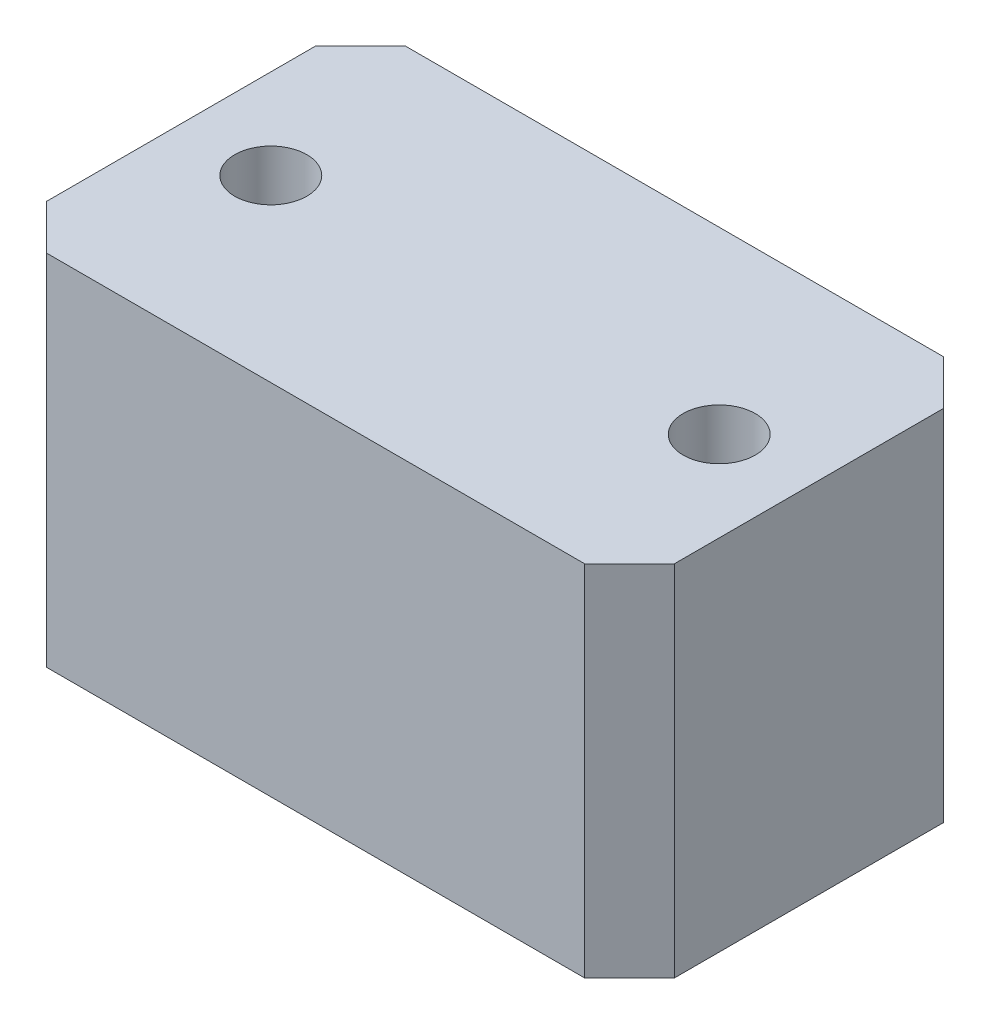
ISO-10303-21;
HEADER;
FILE_DESCRIPTION(('STEP AP214'),'2;1');
FILE_NAME('part.step','',(''),(''),'','','');
FILE_SCHEMA(('AUTOMOTIVE_DESIGN { 1 0 10303 214 1 1 1 1 }'));
ENDSEC;
DATA;
#1=APPLICATION_CONTEXT('core data for automotive mechanical design processes');
#2=APPLICATION_PROTOCOL_DEFINITION('international standard','automotive_design',2000,#1);
#3=PRODUCT_CONTEXT('',#1,'mechanical');
#4=PRODUCT('Part','Part','',(#3));
#5=PRODUCT_RELATED_PRODUCT_CATEGORY('part','',(#4));
#6=PRODUCT_DEFINITION_FORMATION('','',#4);
#7=PRODUCT_DEFINITION_CONTEXT('part definition',#1,'design');
#8=PRODUCT_DEFINITION('design','',#6,#7);
#9=PRODUCT_DEFINITION_SHAPE('','',#8);
#10=(LENGTH_UNIT() NAMED_UNIT(*) SI_UNIT(.MILLI.,.METRE.));
#11=(NAMED_UNIT(*) PLANE_ANGLE_UNIT() SI_UNIT($,.RADIAN.));
#12=(NAMED_UNIT(*) SI_UNIT($,.STERADIAN.) SOLID_ANGLE_UNIT());
#13=UNCERTAINTY_MEASURE_WITH_UNIT(LENGTH_MEASURE(1.E-05),#10,'distance_accuracy_value','');
#14=(GEOMETRIC_REPRESENTATION_CONTEXT(3) GLOBAL_UNCERTAINTY_ASSIGNED_CONTEXT((#13)) GLOBAL_UNIT_ASSIGNED_CONTEXT((#10,
#11,#12)) REPRESENTATION_CONTEXT('',''));
#15=CARTESIAN_POINT('',(0.,0.,0.));
#16=DIRECTION('',(0.,0.,1.));
#17=DIRECTION('',(1.,0.,0.));
#18=AXIS2_PLACEMENT_3D('',#15,#16,#17);
#19=CARTESIAN_POINT('',(22.225,25.4,-12.7));
#20=DIRECTION('',(-1.,0.,0.));
#21=DIRECTION('',(0.,0.,1.));
#22=AXIS2_PLACEMENT_3D('',#19,#20,#21);
#23=PLANE('',#22);
#24=DIRECTION('',(0.,0.,-1.));
#25=VECTOR('',#24,1.);
#26=CARTESIAN_POINT('',(22.225,0.,-12.7));
#27=LINE('',#26,#25);
#28=CARTESIAN_POINT('',(22.225,0.,9.525));
#29=VERTEX_POINT('',#28);
#30=CARTESIAN_POINT('',(22.225,0.,-9.52499999999998));
#31=VERTEX_POINT('',#30);
#32=EDGE_CURVE('E141',#29,#31,#27,.T.);
#33=ORIENTED_EDGE('',*,*,#32,.T.);
#34=DIRECTION('',(0.,1.,0.));
#35=VECTOR('',#34,1.);
#36=CARTESIAN_POINT('',(22.225,25.4,-9.52499999999998));
#37=LINE('',#36,#35);
#38=CARTESIAN_POINT('',(22.225,25.4,-9.52499999999998));
#39=VERTEX_POINT('',#38);
#40=EDGE_CURVE('E11',#31,#39,#37,.T.);
#41=ORIENTED_EDGE('',*,*,#40,.T.);
#42=DIRECTION('',(0.,0.,-1.));
#43=VECTOR('',#42,1.);
#44=CARTESIAN_POINT('',(22.225,25.4,-12.7));
#45=LINE('',#44,#43);
#46=CARTESIAN_POINT('',(22.225,25.4,9.525));
#47=VERTEX_POINT('',#46);
#48=EDGE_CURVE('E139',#47,#39,#45,.T.);
#49=ORIENTED_EDGE('',*,*,#48,.F.);
#50=DIRECTION('',(0.,-1.,0.));
#51=VECTOR('',#50,1.);
#52=CARTESIAN_POINT('',(22.225,25.4,9.525));
#53=LINE('',#52,#51);
#54=EDGE_CURVE('E48',#47,#29,#53,.T.);
#55=ORIENTED_EDGE('',*,*,#54,.T.);
#56=EDGE_LOOP('',(#33,#41,#49,#55));
#57=FACE_BOUND('',#56,.T.);
#58=ADVANCED_FACE('F39',(#57),#23,.F.);
#59=CARTESIAN_POINT('',(-22.225,25.4,-12.7));
#60=DIRECTION('',(0.,0.,1.));
#61=DIRECTION('',(1.,0.,0.));
#62=AXIS2_PLACEMENT_3D('',#59,#60,#61);
#63=PLANE('',#62);
#64=DIRECTION('',(-1.,0.,0.));
#65=VECTOR('',#64,1.);
#66=CARTESIAN_POINT('',(-22.225,0.,-12.7));
#67=LINE('',#66,#65);
#68=CARTESIAN_POINT('',(19.05,0.,-12.7));
#69=VERTEX_POINT('',#68);
#70=CARTESIAN_POINT('',(-19.05,0.,-12.7));
#71=VERTEX_POINT('',#70);
#72=EDGE_CURVE('E135',#69,#71,#67,.T.);
#73=ORIENTED_EDGE('',*,*,#72,.T.);
#74=DIRECTION('',(0.,1.,0.));
#75=VECTOR('',#74,1.);
#76=CARTESIAN_POINT('',(-19.05,25.4,-12.7));
#77=LINE('',#76,#75);
#78=CARTESIAN_POINT('',(-19.05,25.4,-12.7));
#79=VERTEX_POINT('',#78);
#80=EDGE_CURVE('E111',#71,#79,#77,.T.);
#81=ORIENTED_EDGE('',*,*,#80,.T.);
#82=DIRECTION('',(-1.,0.,0.));
#83=VECTOR('',#82,1.);
#84=CARTESIAN_POINT('',(-22.225,25.4,-12.7));
#85=LINE('',#84,#83);
#86=CARTESIAN_POINT('',(19.05,25.4,-12.7));
#87=VERTEX_POINT('',#86);
#88=EDGE_CURVE('E198',#87,#79,#85,.T.);
#89=ORIENTED_EDGE('',*,*,#88,.F.);
#90=DIRECTION('',(0.,-1.,0.));
#91=VECTOR('',#90,1.);
#92=CARTESIAN_POINT('',(19.05,25.4,-12.7));
#93=LINE('',#92,#91);
#94=EDGE_CURVE('E117',#87,#69,#93,.T.);
#95=ORIENTED_EDGE('',*,*,#94,.T.);
#96=EDGE_LOOP('',(#73,#81,#89,#95));
#97=FACE_BOUND('',#96,.T.);
#98=ADVANCED_FACE('F228',(#97),#63,.F.);
#99=CARTESIAN_POINT('',(-22.225,25.4,-12.7));
#100=DIRECTION('',(1.,0.,0.));
#101=DIRECTION('',(0.,0.,-1.));
#102=AXIS2_PLACEMENT_3D('',#99,#100,#101);
#103=PLANE('',#102);
#104=DIRECTION('',(0.,0.,1.));
#105=VECTOR('',#104,1.);
#106=CARTESIAN_POINT('',(-22.225,25.4,-12.7));
#107=LINE('',#106,#105);
#108=CARTESIAN_POINT('',(-22.225,25.4,-9.52499999999999));
#109=VERTEX_POINT('',#108);
#110=CARTESIAN_POINT('',(-22.225,25.4,9.52499999999998));
#111=VERTEX_POINT('',#110);
#112=EDGE_CURVE('E126',#109,#111,#107,.T.);
#113=ORIENTED_EDGE('',*,*,#112,.F.);
#114=DIRECTION('',(0.,-1.,0.));
#115=VECTOR('',#114,1.);
#116=CARTESIAN_POINT('',(-22.225,25.4,-9.52499999999999));
#117=LINE('',#116,#115);
#118=CARTESIAN_POINT('',(-22.225,0.,-9.52499999999999));
#119=VERTEX_POINT('',#118);
#120=EDGE_CURVE('E110',#109,#119,#117,.T.);
#121=ORIENTED_EDGE('',*,*,#120,.T.);
#122=DIRECTION('',(0.,0.,1.));
#123=VECTOR('',#122,1.);
#124=CARTESIAN_POINT('',(-22.225,0.,-12.7));
#125=LINE('',#124,#123);
#126=CARTESIAN_POINT('',(-22.225,0.,9.52499999999998));
#127=VERTEX_POINT('',#126);
#128=EDGE_CURVE('E124',#119,#127,#125,.T.);
#129=ORIENTED_EDGE('',*,*,#128,.T.);
#130=DIRECTION('',(0.,1.,0.));
#131=VECTOR('',#130,1.);
#132=CARTESIAN_POINT('',(-22.225,25.4,9.52499999999998));
#133=LINE('',#132,#131);
#134=EDGE_CURVE('E129',#127,#111,#133,.T.);
#135=ORIENTED_EDGE('',*,*,#134,.T.);
#136=EDGE_LOOP('',(#113,#121,#129,#135));
#137=FACE_BOUND('',#136,.T.);
#138=ADVANCED_FACE('F123',(#137),#103,.F.);
#139=CARTESIAN_POINT('',(-22.225,25.4,12.7));
#140=DIRECTION('',(0.,0.,-1.));
#141=DIRECTION('',(-1.,0.,0.));
#142=AXIS2_PLACEMENT_3D('',#139,#140,#141);
#143=PLANE('',#142);
#144=DIRECTION('',(1.,0.,0.));
#145=VECTOR('',#144,1.);
#146=CARTESIAN_POINT('',(-22.225,25.4,12.7));
#147=LINE('',#146,#145);
#148=CARTESIAN_POINT('',(-19.05,25.4,12.7));
#149=VERTEX_POINT('',#148);
#150=CARTESIAN_POINT('',(19.05,25.4,12.7));
#151=VERTEX_POINT('',#150);
#152=EDGE_CURVE('E146',#149,#151,#147,.T.);
#153=ORIENTED_EDGE('',*,*,#152,.F.);
#154=DIRECTION('',(0.,-1.,0.));
#155=VECTOR('',#154,1.);
#156=CARTESIAN_POINT('',(-19.05,25.4,12.7));
#157=LINE('',#156,#155);
#158=CARTESIAN_POINT('',(-19.05,0.,12.7));
#159=VERTEX_POINT('',#158);
#160=EDGE_CURVE('E173',#149,#159,#157,.T.);
#161=ORIENTED_EDGE('',*,*,#160,.T.);
#162=DIRECTION('',(1.,0.,0.));
#163=VECTOR('',#162,1.);
#164=CARTESIAN_POINT('',(-22.225,0.,12.7));
#165=LINE('',#164,#163);
#166=CARTESIAN_POINT('',(19.05,0.,12.7));
#167=VERTEX_POINT('',#166);
#168=EDGE_CURVE('E134',#159,#167,#165,.T.);
#169=ORIENTED_EDGE('',*,*,#168,.T.);
#170=DIRECTION('',(0.,1.,0.));
#171=VECTOR('',#170,1.);
#172=CARTESIAN_POINT('',(19.05,25.4,12.7));
#173=LINE('',#172,#171);
#174=EDGE_CURVE('E55',#167,#151,#173,.T.);
#175=ORIENTED_EDGE('',*,*,#174,.T.);
#176=EDGE_LOOP('',(#153,#161,#169,#175));
#177=FACE_BOUND('',#176,.T.);
#178=ADVANCED_FACE('F221',(#177),#143,.F.);
#179=CARTESIAN_POINT('',(0.,25.4,0.));
#180=DIRECTION('',(0.,1.,0.));
#181=DIRECTION('',(0.,0.,1.));
#182=AXIS2_PLACEMENT_3D('',#179,#180,#181);
#183=PLANE('',#182);
#184=CARTESIAN_POINT('',(-15.875,25.4,0.));
#185=DIRECTION('',(0.,1.,0.));
#186=DIRECTION('',(0.,0.,1.));
#187=AXIS2_PLACEMENT_3D('',#184,#185,#186);
#188=CIRCLE('',#187,2.5527);
#189=CARTESIAN_POINT('',(-15.875,25.4,2.5527));
#190=VERTEX_POINT('',#189);
#191=EDGE_CURVE('E211',#190,#190,#188,.T.);
#192=ORIENTED_EDGE('',*,*,#191,.F.);
#193=EDGE_LOOP('',(#192));
#194=FACE_BOUND('',#193,.T.);
#195=CARTESIAN_POINT('',(15.875,25.4,0.));
#196=DIRECTION('',(0.,1.,0.));
#197=DIRECTION('',(0.,0.,1.));
#198=AXIS2_PLACEMENT_3D('',#195,#196,#197);
#199=CIRCLE('',#198,2.5527);
#200=CARTESIAN_POINT('',(15.875,25.4,2.5527));
#201=VERTEX_POINT('',#200);
#202=EDGE_CURVE('E191',#201,#201,#199,.T.);
#203=ORIENTED_EDGE('',*,*,#202,.F.);
#204=EDGE_LOOP('',(#203));
#205=FACE_BOUND('',#204,.T.);
#206=ORIENTED_EDGE('',*,*,#88,.T.);
#207=DIRECTION('',(0.707106781186548,0.,-0.707106781186547));
#208=VECTOR('',#207,1.);
#209=CARTESIAN_POINT('',(-15.875,25.4,-15.875));
#210=LINE('',#209,#208);
#211=EDGE_CURVE('E168',#79,#109,#210,.F.);
#212=ORIENTED_EDGE('',*,*,#211,.T.);
#213=ORIENTED_EDGE('',*,*,#112,.T.);
#214=DIRECTION('',(-0.707106781186547,0.,-0.707106781186548));
#215=VECTOR('',#214,1.);
#216=CARTESIAN_POINT('',(-15.875,25.4,15.875));
#217=LINE('',#216,#215);
#218=EDGE_CURVE('E62',#111,#149,#217,.F.);
#219=ORIENTED_EDGE('',*,*,#218,.T.);
#220=ORIENTED_EDGE('',*,*,#152,.T.);
#221=DIRECTION('',(-0.707106781186549,0.,0.707106781186546));
#222=VECTOR('',#221,1.);
#223=CARTESIAN_POINT('',(15.8749999999999,25.4,15.875));
#224=LINE('',#223,#222);
#225=EDGE_CURVE('E160',#151,#47,#224,.F.);
#226=ORIENTED_EDGE('',*,*,#225,.T.);
#227=ORIENTED_EDGE('',*,*,#48,.T.);
#228=DIRECTION('',(0.707106781186546,0.,0.707106781186549));
#229=VECTOR('',#228,1.);
#230=CARTESIAN_POINT('',(15.875,25.4,-15.875));
#231=LINE('',#230,#229);
#232=EDGE_CURVE('E163',#39,#87,#231,.F.);
#233=ORIENTED_EDGE('',*,*,#232,.T.);
#234=EDGE_LOOP('',(#206,#212,#213,#219,#220,#226,#227,#233));
#235=FACE_BOUND('',#234,.T.);
#236=ADVANCED_FACE('F218',(#194,#205,#235),#183,.T.);
#237=CARTESIAN_POINT('',(0.,0.,0.));
#238=DIRECTION('',(0.,1.,0.));
#239=DIRECTION('',(0.,0.,1.));
#240=AXIS2_PLACEMENT_3D('',#237,#238,#239);
#241=PLANE('',#240);
#242=CARTESIAN_POINT('',(-15.875,0.,0.));
#243=DIRECTION('',(0.,1.,0.));
#244=DIRECTION('',(0.,0.,1.));
#245=AXIS2_PLACEMENT_3D('',#242,#243,#244);
#246=CIRCLE('',#245,2.55269999999999);
#247=CARTESIAN_POINT('',(-15.875,0.,2.55269999999999));
#248=VERTEX_POINT('',#247);
#249=EDGE_CURVE('E207',#248,#248,#246,.T.);
#250=ORIENTED_EDGE('',*,*,#249,.T.);
#251=EDGE_LOOP('',(#250));
#252=FACE_BOUND('',#251,.T.);
#253=CARTESIAN_POINT('',(15.875,0.,0.));
#254=DIRECTION('',(0.,1.,0.));
#255=DIRECTION('',(0.,0.,1.));
#256=AXIS2_PLACEMENT_3D('',#253,#254,#255);
#257=CIRCLE('',#256,2.55269999999999);
#258=CARTESIAN_POINT('',(15.875,0.,2.55269999999999));
#259=VERTEX_POINT('',#258);
#260=EDGE_CURVE('E188',#259,#259,#257,.T.);
#261=ORIENTED_EDGE('',*,*,#260,.T.);
#262=EDGE_LOOP('',(#261));
#263=FACE_BOUND('',#262,.T.);
#264=ORIENTED_EDGE('',*,*,#128,.F.);
#265=DIRECTION('',(-0.707106781186548,0.,0.707106781186547));
#266=VECTOR('',#265,1.);
#267=CARTESIAN_POINT('',(-22.225,0.,-9.52499999999999));
#268=LINE('',#267,#266);
#269=EDGE_CURVE('E106',#119,#71,#268,.F.);
#270=ORIENTED_EDGE('',*,*,#269,.T.);
#271=ORIENTED_EDGE('',*,*,#72,.F.);
#272=DIRECTION('',(-0.707106781186546,0.,-0.707106781186549));
#273=VECTOR('',#272,1.);
#274=CARTESIAN_POINT('',(19.05,0.,-12.7));
#275=LINE('',#274,#273);
#276=EDGE_CURVE('E150',#69,#31,#275,.F.);
#277=ORIENTED_EDGE('',*,*,#276,.T.);
#278=ORIENTED_EDGE('',*,*,#32,.F.);
#279=DIRECTION('',(0.707106781186549,0.,-0.707106781186546));
#280=VECTOR('',#279,1.);
#281=CARTESIAN_POINT('',(22.225,0.,9.525));
#282=LINE('',#281,#280);
#283=EDGE_CURVE('E128',#29,#167,#282,.F.);
#284=ORIENTED_EDGE('',*,*,#283,.T.);
#285=ORIENTED_EDGE('',*,*,#168,.F.);
#286=DIRECTION('',(0.707106781186547,0.,0.707106781186548));
#287=VECTOR('',#286,1.);
#288=CARTESIAN_POINT('',(-19.05,0.,12.7));
#289=LINE('',#288,#287);
#290=EDGE_CURVE('E118',#159,#127,#289,.F.);
#291=ORIENTED_EDGE('',*,*,#290,.T.);
#292=EDGE_LOOP('',(#264,#270,#271,#277,#278,#284,#285,#291));
#293=FACE_BOUND('',#292,.T.);
#294=ADVANCED_FACE('F131',(#252,#263,#293),#241,.F.);
#295=CARTESIAN_POINT('',(15.875,25.4,0.));
#296=DIRECTION('',(0.,1.,0.));
#297=DIRECTION('',(0.,0.,1.));
#298=AXIS2_PLACEMENT_3D('',#295,#296,#297);
#299=CYLINDRICAL_SURFACE('',#298,2.55269999999999);
#300=ORIENTED_EDGE('',*,*,#260,.F.);
#301=EDGE_LOOP('',(#300));
#302=FACE_BOUND('',#301,.T.);
#303=ORIENTED_EDGE('',*,*,#202,.T.);
#304=EDGE_LOOP('',(#303));
#305=FACE_BOUND('',#304,.T.);
#306=ADVANCED_FACE('F258',(#302,#305),#299,.F.);
#307=CARTESIAN_POINT('',(-15.875,25.4,0.));
#308=DIRECTION('',(0.,1.,0.));
#309=DIRECTION('',(0.,0.,1.));
#310=AXIS2_PLACEMENT_3D('',#307,#308,#309);
#311=CYLINDRICAL_SURFACE('',#310,2.55269999999999);
#312=ORIENTED_EDGE('',*,*,#249,.F.);
#313=EDGE_LOOP('',(#312));
#314=FACE_BOUND('',#313,.T.);
#315=ORIENTED_EDGE('',*,*,#191,.T.);
#316=EDGE_LOOP('',(#315));
#317=FACE_BOUND('',#316,.T.);
#318=ADVANCED_FACE('F216',(#314,#317),#311,.F.);
#319=CARTESIAN_POINT('',(-22.225,25.4,-9.52499999999999));
#320=DIRECTION('',(0.707106781186547,0.,0.707106781186548));
#321=DIRECTION('',(0.,-1.,0.));
#322=AXIS2_PLACEMENT_3D('',#319,#320,#321);
#323=PLANE('',#322);
#324=ORIENTED_EDGE('',*,*,#211,.F.);
#325=ORIENTED_EDGE('',*,*,#80,.F.);
#326=ORIENTED_EDGE('',*,*,#269,.F.);
#327=ORIENTED_EDGE('',*,*,#120,.F.);
#328=EDGE_LOOP('',(#324,#325,#326,#327));
#329=FACE_BOUND('',#328,.T.);
#330=ADVANCED_FACE('F109',(#329),#323,.F.);
#331=CARTESIAN_POINT('',(-19.05,25.4,12.7));
#332=DIRECTION('',(0.707106781186548,0.,-0.707106781186547));
#333=DIRECTION('',(0.,-1.,0.));
#334=AXIS2_PLACEMENT_3D('',#331,#332,#333);
#335=PLANE('',#334);
#336=ORIENTED_EDGE('',*,*,#218,.F.);
#337=ORIENTED_EDGE('',*,*,#134,.F.);
#338=ORIENTED_EDGE('',*,*,#290,.F.);
#339=ORIENTED_EDGE('',*,*,#160,.F.);
#340=EDGE_LOOP('',(#336,#337,#338,#339));
#341=FACE_BOUND('',#340,.T.);
#342=ADVANCED_FACE('F235',(#341),#335,.F.);
#343=CARTESIAN_POINT('',(19.05,25.4,-12.7));
#344=DIRECTION('',(-0.707106781186549,0.,0.707106781186546));
#345=DIRECTION('',(0.,-1.,0.));
#346=AXIS2_PLACEMENT_3D('',#343,#344,#345);
#347=PLANE('',#346);
#348=ORIENTED_EDGE('',*,*,#232,.F.);
#349=ORIENTED_EDGE('',*,*,#40,.F.);
#350=ORIENTED_EDGE('',*,*,#276,.F.);
#351=ORIENTED_EDGE('',*,*,#94,.F.);
#352=EDGE_LOOP('',(#348,#349,#350,#351));
#353=FACE_BOUND('',#352,.T.);
#354=ADVANCED_FACE('F230',(#353),#347,.F.);
#355=CARTESIAN_POINT('',(22.225,25.4,9.525));
#356=DIRECTION('',(-0.707106781186546,0.,-0.707106781186549));
#357=DIRECTION('',(0.,-1.,0.));
#358=AXIS2_PLACEMENT_3D('',#355,#356,#357);
#359=PLANE('',#358);
#360=ORIENTED_EDGE('',*,*,#225,.F.);
#361=ORIENTED_EDGE('',*,*,#174,.F.);
#362=ORIENTED_EDGE('',*,*,#283,.F.);
#363=ORIENTED_EDGE('',*,*,#54,.F.);
#364=EDGE_LOOP('',(#360,#361,#362,#363));
#365=FACE_BOUND('',#364,.T.);
#366=ADVANCED_FACE('F41',(#365),#359,.F.);
#367=CLOSED_SHELL('',(#58,#98,#138,#178,#236,#294,#306,#318,#330,#342,#354,#366));
#368=MANIFOLD_SOLID_BREP('B2',#367);
#369=ADVANCED_BREP_SHAPE_REPRESENTATION('',(#18,#368),#14);
#370=SHAPE_DEFINITION_REPRESENTATION(#9,#369);
ENDSEC;
END-ISO-10303-21;
